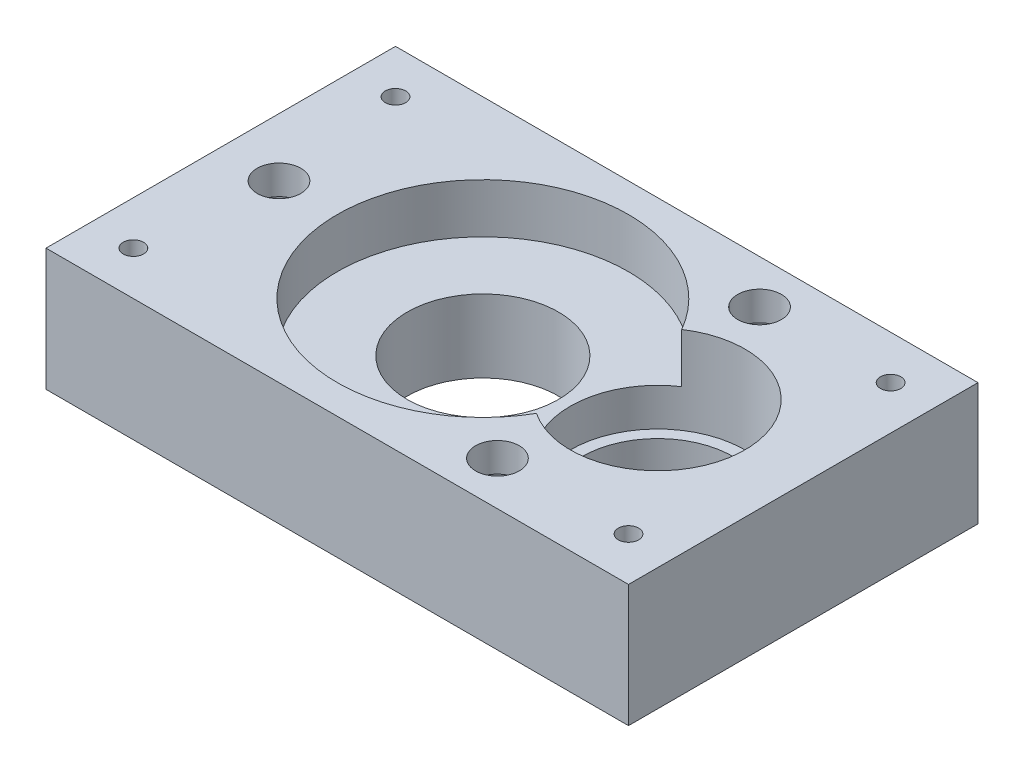
ISO-10303-21;
HEADER;
FILE_DESCRIPTION(('STEP AP214'),'2;1');
FILE_NAME('part.step','',(''),(''),'','','');
FILE_SCHEMA(('AUTOMOTIVE_DESIGN { 1 0 10303 214 1 1 1 1 }'));
ENDSEC;
DATA;
#1=APPLICATION_CONTEXT('core data for automotive mechanical design processes');
#2=APPLICATION_PROTOCOL_DEFINITION('international standard','automotive_design',2000,#1);
#3=PRODUCT_CONTEXT('',#1,'mechanical');
#4=PRODUCT('Part','Part','',(#3));
#5=PRODUCT_RELATED_PRODUCT_CATEGORY('part','',(#4));
#6=PRODUCT_DEFINITION_FORMATION('','',#4);
#7=PRODUCT_DEFINITION_CONTEXT('part definition',#1,'design');
#8=PRODUCT_DEFINITION('design','',#6,#7);
#9=PRODUCT_DEFINITION_SHAPE('','',#8);
#10=(LENGTH_UNIT() NAMED_UNIT(*) SI_UNIT(.MILLI.,.METRE.));
#11=(NAMED_UNIT(*) PLANE_ANGLE_UNIT() SI_UNIT($,.RADIAN.));
#12=(NAMED_UNIT(*) SI_UNIT($,.STERADIAN.) SOLID_ANGLE_UNIT());
#13=UNCERTAINTY_MEASURE_WITH_UNIT(LENGTH_MEASURE(1.E-05),#10,'distance_accuracy_value','');
#14=(GEOMETRIC_REPRESENTATION_CONTEXT(3) GLOBAL_UNCERTAINTY_ASSIGNED_CONTEXT((#13)) GLOBAL_UNIT_ASSIGNED_CONTEXT((#10,
#11,#12)) REPRESENTATION_CONTEXT('',''));
#15=CARTESIAN_POINT('',(0.,0.,0.));
#16=DIRECTION('',(0.,0.,1.));
#17=DIRECTION('',(1.,0.,0.));
#18=AXIS2_PLACEMENT_3D('',#15,#16,#17);
#19=CARTESIAN_POINT('',(0.,3.,0.));
#20=DIRECTION('',(0.,1.,0.));
#21=DIRECTION('',(0.,0.,1.));
#22=AXIS2_PLACEMENT_3D('',#19,#20,#21);
#23=PLANE('',#22);
#24=CARTESIAN_POINT('',(18.5,3.,1.5));
#25=DIRECTION('',(0.,1.,0.));
#26=DIRECTION('',(0.,0.,1.));
#27=AXIS2_PLACEMENT_3D('',#24,#25,#26);
#28=CIRCLE('',#27,0.350000000000001);
#29=CARTESIAN_POINT('',(18.5,3.,1.85));
#30=VERTEX_POINT('',#29);
#31=EDGE_CURVE('E282',#30,#30,#28,.T.);
#32=ORIENTED_EDGE('',*,*,#31,.F.);
#33=EDGE_LOOP('',(#32));
#34=FACE_BOUND('',#33,.T.);
#35=CARTESIAN_POINT('',(18.5,3.,10.5));
#36=DIRECTION('',(0.,1.,0.));
#37=DIRECTION('',(0.,0.,1.));
#38=AXIS2_PLACEMENT_3D('',#35,#36,#37);
#39=CIRCLE('',#38,0.350000000000001);
#40=CARTESIAN_POINT('',(18.5,3.,10.85));
#41=VERTEX_POINT('',#40);
#42=EDGE_CURVE('E291',#41,#41,#39,.T.);
#43=ORIENTED_EDGE('',*,*,#42,.F.);
#44=EDGE_LOOP('',(#43));
#45=FACE_BOUND('',#44,.T.);
#46=CARTESIAN_POINT('',(1.5,3.,10.5));
#47=DIRECTION('',(0.,1.,0.));
#48=DIRECTION('',(0.,0.,1.));
#49=AXIS2_PLACEMENT_3D('',#46,#47,#48);
#50=CIRCLE('',#49,0.349999999999999);
#51=CARTESIAN_POINT('',(1.5,3.,10.85));
#52=VERTEX_POINT('',#51);
#53=EDGE_CURVE('E602',#52,#52,#50,.T.);
#54=ORIENTED_EDGE('',*,*,#53,.F.);
#55=EDGE_LOOP('',(#54));
#56=FACE_BOUND('',#55,.T.);
#57=CARTESIAN_POINT('',(1.5,3.,1.5));
#58=DIRECTION('',(0.,1.,0.));
#59=DIRECTION('',(0.,0.,1.));
#60=AXIS2_PLACEMENT_3D('',#57,#58,#59);
#61=CIRCLE('',#60,0.349999999999999);
#62=CARTESIAN_POINT('',(1.5,3.,1.85));
#63=VERTEX_POINT('',#62);
#64=EDGE_CURVE('E596',#63,#63,#61,.T.);
#65=ORIENTED_EDGE('',*,*,#64,.F.);
#66=EDGE_LOOP('',(#65));
#67=FACE_BOUND('',#66,.T.);
#68=CARTESIAN_POINT('',(14.,3.,10.5));
#69=DIRECTION('',(0.,1.,0.));
#70=DIRECTION('',(0.,0.,1.));
#71=AXIS2_PLACEMENT_3D('',#68,#69,#70);
#72=CIRCLE('',#71,0.75);
#73=CARTESIAN_POINT('',(14.,3.,11.25));
#74=VERTEX_POINT('',#73);
#75=EDGE_CURVE('E592',#74,#74,#72,.T.);
#76=ORIENTED_EDGE('',*,*,#75,.F.);
#77=EDGE_LOOP('',(#76));
#78=FACE_BOUND('',#77,.T.);
#79=CARTESIAN_POINT('',(14.,3.,1.5));
#80=DIRECTION('',(0.,1.,0.));
#81=DIRECTION('',(0.,0.,1.));
#82=AXIS2_PLACEMENT_3D('',#79,#80,#81);
#83=CIRCLE('',#82,0.75);
#84=CARTESIAN_POINT('',(14.,3.,2.25));
#85=VERTEX_POINT('',#84);
#86=EDGE_CURVE('E301',#85,#85,#83,.T.);
#87=ORIENTED_EDGE('',*,*,#86,.F.);
#88=EDGE_LOOP('',(#87));
#89=FACE_BOUND('',#88,.T.);
#90=CARTESIAN_POINT('',(2.,3.,6.));
#91=DIRECTION('',(0.,1.,0.));
#92=DIRECTION('',(0.,0.,1.));
#93=AXIS2_PLACEMENT_3D('',#90,#91,#92);
#94=CIRCLE('',#93,0.75);
#95=CARTESIAN_POINT('',(2.,3.,6.75));
#96=VERTEX_POINT('',#95);
#97=EDGE_CURVE('E297',#96,#96,#94,.T.);
#98=ORIENTED_EDGE('',*,*,#97,.F.);
#99=EDGE_LOOP('',(#98));
#100=FACE_BOUND('',#99,.T.);
#101=DIRECTION('',(0.,0.,1.));
#102=VECTOR('',#101,1.);
#103=CARTESIAN_POINT('',(0.,3.,0.));
#104=LINE('',#103,#102);
#105=CARTESIAN_POINT('',(0.,3.,0.));
#106=VERTEX_POINT('',#105);
#107=CARTESIAN_POINT('',(0.,3.,12.));
#108=VERTEX_POINT('',#107);
#109=EDGE_CURVE('E258',#106,#108,#104,.T.);
#110=ORIENTED_EDGE('',*,*,#109,.T.);
#111=DIRECTION('',(1.,0.,0.));
#112=VECTOR('',#111,1.);
#113=CARTESIAN_POINT('',(0.,3.,12.));
#114=LINE('',#113,#112);
#115=CARTESIAN_POINT('',(20.,3.,12.));
#116=VERTEX_POINT('',#115);
#117=EDGE_CURVE('E261',#108,#116,#114,.T.);
#118=ORIENTED_EDGE('',*,*,#117,.T.);
#119=DIRECTION('',(0.,0.,1.));
#120=VECTOR('',#119,1.);
#121=CARTESIAN_POINT('',(20.,3.,0.));
#122=LINE('',#121,#120);
#123=CARTESIAN_POINT('',(20.,3.,0.));
#124=VERTEX_POINT('',#123);
#125=EDGE_CURVE('E263',#124,#116,#122,.T.);
#126=ORIENTED_EDGE('',*,*,#125,.F.);
#127=DIRECTION('',(1.,0.,0.));
#128=VECTOR('',#127,1.);
#129=CARTESIAN_POINT('',(0.,3.,0.));
#130=LINE('',#129,#128);
#131=EDGE_CURVE('E223',#106,#124,#130,.T.);
#132=ORIENTED_EDGE('',*,*,#131,.F.);
#133=EDGE_LOOP('',(#110,#118,#126,#132));
#134=FACE_BOUND('',#133,.T.);
#135=CARTESIAN_POINT('',(15.,3.,6.));
#136=DIRECTION('',(0.,1.,0.));
#137=DIRECTION('',(0.,0.,1.));
#138=AXIS2_PLACEMENT_3D('',#135,#136,#137);
#139=CIRCLE('',#138,3.);
#140=CARTESIAN_POINT('',(13.3333333333333,3.,8.49443825784929));
#141=VERTEX_POINT('',#140);
#142=CARTESIAN_POINT('',(13.3333333333333,3.,3.50556174215071));
#143=VERTEX_POINT('',#142);
#144=EDGE_CURVE('E256',#141,#143,#139,.T.);
#145=ORIENTED_EDGE('',*,*,#144,.F.);
#146=CARTESIAN_POINT('',(9.,3.,6.));
#147=DIRECTION('',(0.,1.,0.));
#148=DIRECTION('',(0.,0.,1.));
#149=AXIS2_PLACEMENT_3D('',#146,#147,#148);
#150=CIRCLE('',#149,5.);
#151=EDGE_CURVE('E254',#143,#141,#150,.T.);
#152=ORIENTED_EDGE('',*,*,#151,.F.);
#153=EDGE_LOOP('',(#145,#152));
#154=FACE_BOUND('',#153,.T.);
#155=ADVANCED_FACE('F163',(#34,#45,#56,#67,#78,#89,#100,#134,#154),#23,.T.);
#156=CARTESIAN_POINT('',(15.,3.,6.));
#157=DIRECTION('',(0.,-1.,0.));
#158=DIRECTION('',(0.,0.,-1.));
#159=AXIS2_PLACEMENT_3D('',#156,#157,#158);
#160=CYLINDRICAL_SURFACE('',#159,3.);
#161=CARTESIAN_POINT('',(15.,0.,6.));
#162=DIRECTION('',(0.,1.,0.));
#163=DIRECTION('',(0.,0.,1.));
#164=AXIS2_PLACEMENT_3D('',#161,#162,#163);
#165=CIRCLE('',#164,3.);
#166=CARTESIAN_POINT('',(15.,0.,9.));
#167=VERTEX_POINT('',#166);
#168=EDGE_CURVE('E13',#167,#167,#165,.T.);
#169=ORIENTED_EDGE('',*,*,#168,.F.);
#170=EDGE_LOOP('',(#169));
#171=FACE_BOUND('',#170,.T.);
#172=DIRECTION('',(0.,-1.,0.));
#173=VECTOR('',#172,1.);
#174=CARTESIAN_POINT('',(13.3333333333333,1.5,3.50556174215071));
#175=LINE('',#174,#173);
#176=CARTESIAN_POINT('',(13.3333333333333,1.3,3.50556174215071));
#177=VERTEX_POINT('',#176);
#178=EDGE_CURVE('E271',#143,#177,#175,.T.);
#179=ORIENTED_EDGE('',*,*,#178,.T.);
#180=CARTESIAN_POINT('',(15.,1.3,6.));
#181=DIRECTION('',(0.,1.,0.));
#182=DIRECTION('',(0.,0.,1.));
#183=AXIS2_PLACEMENT_3D('',#180,#181,#182);
#184=CIRCLE('',#183,3.);
#185=CARTESIAN_POINT('',(13.3333333333333,1.3,8.49443825784929));
#186=VERTEX_POINT('',#185);
#187=EDGE_CURVE('E247',#177,#186,#184,.T.);
#188=ORIENTED_EDGE('',*,*,#187,.T.);
#189=DIRECTION('',(0.,-1.,0.));
#190=VECTOR('',#189,1.);
#191=CARTESIAN_POINT('',(13.3333333333333,1.5,8.49443825784929));
#192=LINE('',#191,#190);
#193=EDGE_CURVE('E186',#186,#141,#192,.F.);
#194=ORIENTED_EDGE('',*,*,#193,.T.);
#195=ORIENTED_EDGE('',*,*,#144,.T.);
#196=EDGE_LOOP('',(#179,#188,#194,#195));
#197=FACE_BOUND('',#196,.T.);
#198=ADVANCED_FACE('F310',(#171,#197),#160,.F.);
#199=CARTESIAN_POINT('',(0.,3.,0.));
#200=DIRECTION('',(1.,0.,0.));
#201=DIRECTION('',(0.,0.,-1.));
#202=AXIS2_PLACEMENT_3D('',#199,#200,#201);
#203=PLANE('',#202);
#204=DIRECTION('',(0.,-1.,0.));
#205=VECTOR('',#204,1.);
#206=CARTESIAN_POINT('',(0.,3.,0.));
#207=LINE('',#206,#205);
#208=CARTESIAN_POINT('',(0.,-1.2,0.));
#209=VERTEX_POINT('',#208);
#210=EDGE_CURVE('E229',#106,#209,#207,.T.);
#211=ORIENTED_EDGE('',*,*,#210,.T.);
#212=DIRECTION('',(0.,0.,-1.));
#213=VECTOR('',#212,1.);
#214=CARTESIAN_POINT('',(0.,-1.2,0.));
#215=LINE('',#214,#213);
#216=CARTESIAN_POINT('',(0.,-1.2,12.));
#217=VERTEX_POINT('',#216);
#218=EDGE_CURVE('E239',#217,#209,#215,.T.);
#219=ORIENTED_EDGE('',*,*,#218,.F.);
#220=DIRECTION('',(0.,-1.,0.));
#221=VECTOR('',#220,1.);
#222=CARTESIAN_POINT('',(0.,3.,12.));
#223=LINE('',#222,#221);
#224=EDGE_CURVE('E268',#108,#217,#223,.T.);
#225=ORIENTED_EDGE('',*,*,#224,.F.);
#226=ORIENTED_EDGE('',*,*,#109,.F.);
#227=EDGE_LOOP('',(#211,#219,#225,#226));
#228=FACE_BOUND('',#227,.T.);
#229=ADVANCED_FACE('F165',(#228),#203,.F.);
#230=CARTESIAN_POINT('',(0.,3.,12.));
#231=DIRECTION('',(0.,0.,-1.));
#232=DIRECTION('',(-1.,0.,0.));
#233=AXIS2_PLACEMENT_3D('',#230,#231,#232);
#234=PLANE('',#233);
#235=ORIENTED_EDGE('',*,*,#224,.T.);
#236=DIRECTION('',(-1.,0.,0.));
#237=VECTOR('',#236,1.);
#238=CARTESIAN_POINT('',(0.,-1.2,12.));
#239=LINE('',#238,#237);
#240=CARTESIAN_POINT('',(20.,-1.2,12.));
#241=VERTEX_POINT('',#240);
#242=EDGE_CURVE('E252',#241,#217,#239,.T.);
#243=ORIENTED_EDGE('',*,*,#242,.F.);
#244=DIRECTION('',(0.,-1.,0.));
#245=VECTOR('',#244,1.);
#246=CARTESIAN_POINT('',(20.,3.,12.));
#247=LINE('',#246,#245);
#248=EDGE_CURVE('E228',#116,#241,#247,.T.);
#249=ORIENTED_EDGE('',*,*,#248,.F.);
#250=ORIENTED_EDGE('',*,*,#117,.F.);
#251=EDGE_LOOP('',(#235,#243,#249,#250));
#252=FACE_BOUND('',#251,.T.);
#253=ADVANCED_FACE('F341',(#252),#234,.F.);
#254=CARTESIAN_POINT('',(20.,3.,0.));
#255=DIRECTION('',(1.,0.,0.));
#256=DIRECTION('',(0.,0.,-1.));
#257=AXIS2_PLACEMENT_3D('',#254,#255,#256);
#258=PLANE('',#257);
#259=ORIENTED_EDGE('',*,*,#248,.T.);
#260=DIRECTION('',(0.,0.,-1.));
#261=VECTOR('',#260,1.);
#262=CARTESIAN_POINT('',(20.,-1.2,0.));
#263=LINE('',#262,#261);
#264=CARTESIAN_POINT('',(20.,-1.2,0.));
#265=VERTEX_POINT('',#264);
#266=EDGE_CURVE('E237',#241,#265,#263,.T.);
#267=ORIENTED_EDGE('',*,*,#266,.T.);
#268=DIRECTION('',(0.,-1.,0.));
#269=VECTOR('',#268,1.);
#270=CARTESIAN_POINT('',(20.,3.,0.));
#271=LINE('',#270,#269);
#272=EDGE_CURVE('E218',#124,#265,#271,.T.);
#273=ORIENTED_EDGE('',*,*,#272,.F.);
#274=ORIENTED_EDGE('',*,*,#125,.T.);
#275=EDGE_LOOP('',(#259,#267,#273,#274));
#276=FACE_BOUND('',#275,.T.);
#277=ADVANCED_FACE('F241',(#276),#258,.T.);
#278=CARTESIAN_POINT('',(0.,3.,0.));
#279=DIRECTION('',(0.,0.,-1.));
#280=DIRECTION('',(-1.,0.,0.));
#281=AXIS2_PLACEMENT_3D('',#278,#279,#280);
#282=PLANE('',#281);
#283=ORIENTED_EDGE('',*,*,#272,.T.);
#284=DIRECTION('',(-1.,0.,0.));
#285=VECTOR('',#284,1.);
#286=CARTESIAN_POINT('',(0.,-1.2,0.));
#287=LINE('',#286,#285);
#288=EDGE_CURVE('E221',#265,#209,#287,.T.);
#289=ORIENTED_EDGE('',*,*,#288,.T.);
#290=ORIENTED_EDGE('',*,*,#210,.F.);
#291=ORIENTED_EDGE('',*,*,#131,.T.);
#292=EDGE_LOOP('',(#283,#289,#290,#291));
#293=FACE_BOUND('',#292,.T.);
#294=ADVANCED_FACE('F220',(#293),#282,.T.);
#295=CARTESIAN_POINT('',(9.,3.,6.));
#296=DIRECTION('',(0.,-1.,0.));
#297=DIRECTION('',(0.,0.,-1.));
#298=AXIS2_PLACEMENT_3D('',#295,#296,#297);
#299=CYLINDRICAL_SURFACE('',#298,5.);
#300=CARTESIAN_POINT('',(9.,1.3,6.));
#301=DIRECTION('',(0.,1.,0.));
#302=DIRECTION('',(0.,0.,1.));
#303=AXIS2_PLACEMENT_3D('',#300,#301,#302);
#304=CIRCLE('',#303,5.);
#305=EDGE_CURVE('E172',#177,#186,#304,.T.);
#306=ORIENTED_EDGE('',*,*,#305,.F.);
#307=ORIENTED_EDGE('',*,*,#178,.F.);
#308=ORIENTED_EDGE('',*,*,#151,.T.);
#309=ORIENTED_EDGE('',*,*,#193,.F.);
#310=EDGE_LOOP('',(#306,#307,#308,#309));
#311=FACE_BOUND('',#310,.T.);
#312=ADVANCED_FACE('F314',(#311),#299,.F.);
#313=CARTESIAN_POINT('',(0.,1.3,0.));
#314=DIRECTION('',(0.,1.,0.));
#315=DIRECTION('',(0.,0.,1.));
#316=AXIS2_PLACEMENT_3D('',#313,#314,#315);
#317=PLANE('',#316);
#318=CARTESIAN_POINT('',(9.,1.3,6.));
#319=DIRECTION('',(0.,1.,0.));
#320=DIRECTION('',(0.,0.,1.));
#321=AXIS2_PLACEMENT_3D('',#318,#319,#320);
#322=CIRCLE('',#321,2.6);
#323=CARTESIAN_POINT('',(9.,1.3,8.6));
#324=VERTEX_POINT('',#323);
#325=EDGE_CURVE('E305',#324,#324,#322,.T.);
#326=ORIENTED_EDGE('',*,*,#325,.F.);
#327=EDGE_LOOP('',(#326));
#328=FACE_BOUND('',#327,.T.);
#329=ORIENTED_EDGE('',*,*,#187,.F.);
#330=ORIENTED_EDGE('',*,*,#305,.T.);
#331=EDGE_LOOP('',(#329,#330));
#332=FACE_BOUND('',#331,.T.);
#333=ADVANCED_FACE('F312',(#328,#332),#317,.T.);
#334=CARTESIAN_POINT('',(0.,-1.2,0.));
#335=DIRECTION('',(0.,1.,0.));
#336=DIRECTION('',(0.,0.,1.));
#337=AXIS2_PLACEMENT_3D('',#334,#335,#336);
#338=PLANE('',#337);
#339=CARTESIAN_POINT('',(14.,-1.2,1.5));
#340=DIRECTION('',(0.,1.,0.));
#341=DIRECTION('',(0.,0.,1.));
#342=AXIS2_PLACEMENT_3D('',#339,#340,#341);
#343=CIRCLE('',#342,1.);
#344=CARTESIAN_POINT('',(14.,-1.2,2.5));
#345=VERTEX_POINT('',#344);
#346=EDGE_CURVE('E632',#345,#345,#343,.T.);
#347=ORIENTED_EDGE('',*,*,#346,.T.);
#348=EDGE_LOOP('',(#347));
#349=FACE_BOUND('',#348,.T.);
#350=CARTESIAN_POINT('',(14.,-1.2,10.5));
#351=DIRECTION('',(0.,1.,0.));
#352=DIRECTION('',(0.,0.,1.));
#353=AXIS2_PLACEMENT_3D('',#350,#351,#352);
#354=CIRCLE('',#353,0.999999999999999);
#355=CARTESIAN_POINT('',(14.,-1.2,11.5));
#356=VERTEX_POINT('',#355);
#357=EDGE_CURVE('E587',#356,#356,#354,.T.);
#358=ORIENTED_EDGE('',*,*,#357,.T.);
#359=EDGE_LOOP('',(#358));
#360=FACE_BOUND('',#359,.T.);
#361=CARTESIAN_POINT('',(2.,-1.2,6.));
#362=DIRECTION('',(0.,1.,0.));
#363=DIRECTION('',(0.,0.,1.));
#364=AXIS2_PLACEMENT_3D('',#361,#362,#363);
#365=CIRCLE('',#364,1.);
#366=CARTESIAN_POINT('',(2.,-1.2,7.));
#367=VERTEX_POINT('',#366);
#368=EDGE_CURVE('E581',#367,#367,#365,.T.);
#369=ORIENTED_EDGE('',*,*,#368,.T.);
#370=EDGE_LOOP('',(#369));
#371=FACE_BOUND('',#370,.T.);
#372=CARTESIAN_POINT('',(18.5,-1.2,1.5));
#373=DIRECTION('',(0.,1.,0.));
#374=DIRECTION('',(0.,0.,1.));
#375=AXIS2_PLACEMENT_3D('',#372,#373,#374);
#376=CIRCLE('',#375,0.350000000000001);
#377=CARTESIAN_POINT('',(18.5,-1.2,1.85));
#378=VERTEX_POINT('',#377);
#379=EDGE_CURVE('E286',#378,#378,#376,.T.);
#380=ORIENTED_EDGE('',*,*,#379,.T.);
#381=EDGE_LOOP('',(#380));
#382=FACE_BOUND('',#381,.T.);
#383=CARTESIAN_POINT('',(18.5,-1.2,10.5));
#384=DIRECTION('',(0.,1.,0.));
#385=DIRECTION('',(0.,0.,1.));
#386=AXIS2_PLACEMENT_3D('',#383,#384,#385);
#387=CIRCLE('',#386,0.350000000000001);
#388=CARTESIAN_POINT('',(18.5,-1.2,10.85));
#389=VERTEX_POINT('',#388);
#390=EDGE_CURVE('E294',#389,#389,#387,.T.);
#391=ORIENTED_EDGE('',*,*,#390,.T.);
#392=EDGE_LOOP('',(#391));
#393=FACE_BOUND('',#392,.T.);
#394=CARTESIAN_POINT('',(1.5,-1.2,10.5));
#395=DIRECTION('',(0.,1.,0.));
#396=DIRECTION('',(0.,0.,1.));
#397=AXIS2_PLACEMENT_3D('',#394,#395,#396);
#398=CIRCLE('',#397,0.349999999999999);
#399=CARTESIAN_POINT('',(1.5,-1.2,10.85));
#400=VERTEX_POINT('',#399);
#401=EDGE_CURVE('E599',#400,#400,#398,.T.);
#402=ORIENTED_EDGE('',*,*,#401,.T.);
#403=EDGE_LOOP('',(#402));
#404=FACE_BOUND('',#403,.T.);
#405=CARTESIAN_POINT('',(1.5,-1.2,1.5));
#406=DIRECTION('',(0.,1.,0.));
#407=DIRECTION('',(0.,0.,1.));
#408=AXIS2_PLACEMENT_3D('',#405,#406,#407);
#409=CIRCLE('',#408,0.349999999999999);
#410=CARTESIAN_POINT('',(1.5,-1.2,1.85));
#411=VERTEX_POINT('',#410);
#412=EDGE_CURVE('E595',#411,#411,#409,.T.);
#413=ORIENTED_EDGE('',*,*,#412,.T.);
#414=EDGE_LOOP('',(#413));
#415=FACE_BOUND('',#414,.T.);
#416=CARTESIAN_POINT('',(9.,-1.2,6.));
#417=DIRECTION('',(0.,1.,0.));
#418=DIRECTION('',(0.,0.,1.));
#419=AXIS2_PLACEMENT_3D('',#416,#417,#418);
#420=CIRCLE('',#419,2.6);
#421=CARTESIAN_POINT('',(9.,-1.2,8.6));
#422=VERTEX_POINT('',#421);
#423=EDGE_CURVE('E244',#422,#422,#420,.T.);
#424=ORIENTED_EDGE('',*,*,#423,.T.);
#425=EDGE_LOOP('',(#424));
#426=FACE_BOUND('',#425,.T.);
#427=ORIENTED_EDGE('',*,*,#266,.F.);
#428=ORIENTED_EDGE('',*,*,#242,.T.);
#429=ORIENTED_EDGE('',*,*,#218,.T.);
#430=ORIENTED_EDGE('',*,*,#288,.F.);
#431=EDGE_LOOP('',(#427,#428,#429,#430));
#432=FACE_BOUND('',#431,.T.);
#433=CARTESIAN_POINT('',(15.,-1.2,6.));
#434=DIRECTION('',(0.,1.,0.));
#435=DIRECTION('',(0.,0.,1.));
#436=AXIS2_PLACEMENT_3D('',#433,#434,#435);
#437=CIRCLE('',#436,2.6);
#438=CARTESIAN_POINT('',(15.,-1.2,8.6));
#439=VERTEX_POINT('',#438);
#440=EDGE_CURVE('E300',#439,#439,#437,.T.);
#441=ORIENTED_EDGE('',*,*,#440,.T.);
#442=EDGE_LOOP('',(#441));
#443=FACE_BOUND('',#442,.T.);
#444=ADVANCED_FACE('F234',(#349,#360,#371,#382,#393,#404,#415,#426,#432,#443),#338,.F.);
#445=CARTESIAN_POINT('',(9.,-1.2,6.));
#446=DIRECTION('',(0.,1.,0.));
#447=DIRECTION('',(0.,0.,1.));
#448=AXIS2_PLACEMENT_3D('',#445,#446,#447);
#449=CYLINDRICAL_SURFACE('',#448,2.6);
#450=ORIENTED_EDGE('',*,*,#325,.T.);
#451=EDGE_LOOP('',(#450));
#452=FACE_BOUND('',#451,.T.);
#453=ORIENTED_EDGE('',*,*,#423,.F.);
#454=EDGE_LOOP('',(#453));
#455=FACE_BOUND('',#454,.T.);
#456=ADVANCED_FACE('F321',(#452,#455),#449,.F.);
#457=CARTESIAN_POINT('',(0.,0.,0.));
#458=DIRECTION('',(0.,1.,0.));
#459=DIRECTION('',(0.,0.,1.));
#460=AXIS2_PLACEMENT_3D('',#457,#458,#459);
#461=PLANE('',#460);
#462=ORIENTED_EDGE('',*,*,#168,.T.);
#463=EDGE_LOOP('',(#462));
#464=FACE_BOUND('',#463,.T.);
#465=CARTESIAN_POINT('',(15.,0.,6.));
#466=DIRECTION('',(0.,1.,0.));
#467=DIRECTION('',(0.,0.,1.));
#468=AXIS2_PLACEMENT_3D('',#465,#466,#467);
#469=CIRCLE('',#468,2.6);
#470=CARTESIAN_POINT('',(15.,0.,8.6));
#471=VERTEX_POINT('',#470);
#472=EDGE_CURVE('E302',#471,#471,#469,.T.);
#473=ORIENTED_EDGE('',*,*,#472,.F.);
#474=EDGE_LOOP('',(#473));
#475=FACE_BOUND('',#474,.T.);
#476=ADVANCED_FACE('F551',(#464,#475),#461,.T.);
#477=CARTESIAN_POINT('',(15.,0.,6.));
#478=DIRECTION('',(0.,-1.,0.));
#479=DIRECTION('',(0.,0.,-1.));
#480=AXIS2_PLACEMENT_3D('',#477,#478,#479);
#481=CYLINDRICAL_SURFACE('',#480,2.6);
#482=ORIENTED_EDGE('',*,*,#472,.T.);
#483=EDGE_LOOP('',(#482));
#484=FACE_BOUND('',#483,.T.);
#485=ORIENTED_EDGE('',*,*,#440,.F.);
#486=EDGE_LOOP('',(#485));
#487=FACE_BOUND('',#486,.T.);
#488=ADVANCED_FACE('F409',(#484,#487),#481,.F.);
#489=CARTESIAN_POINT('',(2.,3.,6.));
#490=DIRECTION('',(0.,-1.,0.));
#491=DIRECTION('',(0.,0.,-1.));
#492=AXIS2_PLACEMENT_3D('',#489,#490,#491);
#493=CYLINDRICAL_SURFACE('',#492,0.75);
#494=CARTESIAN_POINT('',(2.,2.,6.));
#495=DIRECTION('',(0.,1.,0.));
#496=DIRECTION('',(0.,0.,1.));
#497=AXIS2_PLACEMENT_3D('',#494,#495,#496);
#498=CIRCLE('',#497,0.75);
#499=CARTESIAN_POINT('',(2.,2.,6.75));
#500=VERTEX_POINT('',#499);
#501=EDGE_CURVE('E167',#500,#500,#498,.T.);
#502=ORIENTED_EDGE('',*,*,#501,.F.);
#503=EDGE_LOOP('',(#502));
#504=FACE_BOUND('',#503,.T.);
#505=ORIENTED_EDGE('',*,*,#97,.T.);
#506=EDGE_LOOP('',(#505));
#507=FACE_BOUND('',#506,.T.);
#508=ADVANCED_FACE('F468',(#504,#507),#493,.F.);
#509=CARTESIAN_POINT('',(14.,3.,1.5));
#510=DIRECTION('',(0.,-1.,0.));
#511=DIRECTION('',(0.,0.,-1.));
#512=AXIS2_PLACEMENT_3D('',#509,#510,#511);
#513=CYLINDRICAL_SURFACE('',#512,0.75);
#514=CARTESIAN_POINT('',(14.,2.,1.5));
#515=DIRECTION('',(0.,1.,0.));
#516=DIRECTION('',(0.,0.,1.));
#517=AXIS2_PLACEMENT_3D('',#514,#515,#516);
#518=CIRCLE('',#517,0.75);
#519=CARTESIAN_POINT('',(14.,2.,2.25));
#520=VERTEX_POINT('',#519);
#521=EDGE_CURVE('E276',#520,#520,#518,.T.);
#522=ORIENTED_EDGE('',*,*,#521,.F.);
#523=EDGE_LOOP('',(#522));
#524=FACE_BOUND('',#523,.T.);
#525=ORIENTED_EDGE('',*,*,#86,.T.);
#526=EDGE_LOOP('',(#525));
#527=FACE_BOUND('',#526,.T.);
#528=ADVANCED_FACE('F473',(#524,#527),#513,.F.);
#529=CARTESIAN_POINT('',(14.,3.,10.5));
#530=DIRECTION('',(0.,-1.,0.));
#531=DIRECTION('',(0.,0.,-1.));
#532=AXIS2_PLACEMENT_3D('',#529,#530,#531);
#533=CYLINDRICAL_SURFACE('',#532,0.75);
#534=CARTESIAN_POINT('',(14.,2.,10.5));
#535=DIRECTION('',(0.,1.,0.));
#536=DIRECTION('',(0.,0.,1.));
#537=AXIS2_PLACEMENT_3D('',#534,#535,#536);
#538=CIRCLE('',#537,0.75);
#539=CARTESIAN_POINT('',(14.,2.,11.25));
#540=VERTEX_POINT('',#539);
#541=EDGE_CURVE('E274',#540,#540,#538,.T.);
#542=ORIENTED_EDGE('',*,*,#541,.F.);
#543=EDGE_LOOP('',(#542));
#544=FACE_BOUND('',#543,.T.);
#545=ORIENTED_EDGE('',*,*,#75,.T.);
#546=EDGE_LOOP('',(#545));
#547=FACE_BOUND('',#546,.T.);
#548=ADVANCED_FACE('F420',(#544,#547),#533,.F.);
#549=CARTESIAN_POINT('',(1.5,3.,1.5));
#550=DIRECTION('',(0.,-1.,0.));
#551=DIRECTION('',(0.,0.,-1.));
#552=AXIS2_PLACEMENT_3D('',#549,#550,#551);
#553=CYLINDRICAL_SURFACE('',#552,0.349999999999999);
#554=ORIENTED_EDGE('',*,*,#64,.T.);
#555=EDGE_LOOP('',(#554));
#556=FACE_BOUND('',#555,.T.);
#557=ORIENTED_EDGE('',*,*,#412,.F.);
#558=EDGE_LOOP('',(#557));
#559=FACE_BOUND('',#558,.T.);
#560=ADVANCED_FACE('F414',(#556,#559),#553,.F.);
#561=CARTESIAN_POINT('',(1.5,3.,10.5));
#562=DIRECTION('',(0.,-1.,0.));
#563=DIRECTION('',(0.,0.,-1.));
#564=AXIS2_PLACEMENT_3D('',#561,#562,#563);
#565=CYLINDRICAL_SURFACE('',#564,0.349999999999999);
#566=ORIENTED_EDGE('',*,*,#53,.T.);
#567=EDGE_LOOP('',(#566));
#568=FACE_BOUND('',#567,.T.);
#569=ORIENTED_EDGE('',*,*,#401,.F.);
#570=EDGE_LOOP('',(#569));
#571=FACE_BOUND('',#570,.T.);
#572=ADVANCED_FACE('F419',(#568,#571),#565,.F.);
#573=CARTESIAN_POINT('',(18.5,3.,10.5));
#574=DIRECTION('',(0.,-1.,0.));
#575=DIRECTION('',(0.,0.,-1.));
#576=AXIS2_PLACEMENT_3D('',#573,#574,#575);
#577=CYLINDRICAL_SURFACE('',#576,0.350000000000001);
#578=ORIENTED_EDGE('',*,*,#42,.T.);
#579=EDGE_LOOP('',(#578));
#580=FACE_BOUND('',#579,.T.);
#581=ORIENTED_EDGE('',*,*,#390,.F.);
#582=EDGE_LOOP('',(#581));
#583=FACE_BOUND('',#582,.T.);
#584=ADVANCED_FACE('F432',(#580,#583),#577,.F.);
#585=CARTESIAN_POINT('',(18.5,3.,1.5));
#586=DIRECTION('',(0.,-1.,0.));
#587=DIRECTION('',(0.,0.,-1.));
#588=AXIS2_PLACEMENT_3D('',#585,#586,#587);
#589=CYLINDRICAL_SURFACE('',#588,0.350000000000001);
#590=ORIENTED_EDGE('',*,*,#31,.T.);
#591=EDGE_LOOP('',(#590));
#592=FACE_BOUND('',#591,.T.);
#593=ORIENTED_EDGE('',*,*,#379,.F.);
#594=EDGE_LOOP('',(#593));
#595=FACE_BOUND('',#594,.T.);
#596=ADVANCED_FACE('F442',(#592,#595),#589,.F.);
#597=CARTESIAN_POINT('',(14.,5.82842712474619,10.5));
#598=DIRECTION('',(0.,-1.,0.));
#599=DIRECTION('',(0.,0.,-1.));
#600=AXIS2_PLACEMENT_3D('',#597,#598,#599);
#601=CYLINDRICAL_SURFACE('',#600,0.999999999999999);
#602=ORIENTED_EDGE('',*,*,#357,.F.);
#603=EDGE_LOOP('',(#602));
#604=FACE_BOUND('',#603,.T.);
#605=CARTESIAN_POINT('',(14.,2.,10.5));
#606=DIRECTION('',(0.,1.,0.));
#607=DIRECTION('',(0.,0.,1.));
#608=AXIS2_PLACEMENT_3D('',#605,#606,#607);
#609=CIRCLE('',#608,0.999999999999999);
#610=CARTESIAN_POINT('',(14.,2.,11.5));
#611=VERTEX_POINT('',#610);
#612=EDGE_CURVE('E584',#611,#611,#609,.T.);
#613=ORIENTED_EDGE('',*,*,#612,.T.);
#614=EDGE_LOOP('',(#613));
#615=FACE_BOUND('',#614,.T.);
#616=ADVANCED_FACE('F452',(#604,#615),#601,.F.);
#617=CARTESIAN_POINT('',(0.,2.,0.));
#618=DIRECTION('',(0.,1.,0.));
#619=DIRECTION('',(0.,0.,1.));
#620=AXIS2_PLACEMENT_3D('',#617,#618,#619);
#621=PLANE('',#620);
#622=ORIENTED_EDGE('',*,*,#541,.T.);
#623=EDGE_LOOP('',(#622));
#624=FACE_BOUND('',#623,.T.);
#625=ORIENTED_EDGE('',*,*,#612,.F.);
#626=EDGE_LOOP('',(#625));
#627=FACE_BOUND('',#626,.T.);
#628=ADVANCED_FACE('F497',(#624,#627),#621,.F.);
#629=CARTESIAN_POINT('',(14.,5.82842712474619,1.5));
#630=DIRECTION('',(0.,-1.,0.));
#631=DIRECTION('',(0.,0.,-1.));
#632=AXIS2_PLACEMENT_3D('',#629,#630,#631);
#633=CYLINDRICAL_SURFACE('',#632,1.);
#634=ORIENTED_EDGE('',*,*,#346,.F.);
#635=EDGE_LOOP('',(#634));
#636=FACE_BOUND('',#635,.T.);
#637=CARTESIAN_POINT('',(14.,2.,1.5));
#638=DIRECTION('',(0.,1.,0.));
#639=DIRECTION('',(0.,0.,1.));
#640=AXIS2_PLACEMENT_3D('',#637,#638,#639);
#641=CIRCLE('',#640,1.);
#642=CARTESIAN_POINT('',(14.,2.,2.5));
#643=VERTEX_POINT('',#642);
#644=EDGE_CURVE('E277',#643,#643,#641,.T.);
#645=ORIENTED_EDGE('',*,*,#644,.T.);
#646=EDGE_LOOP('',(#645));
#647=FACE_BOUND('',#646,.T.);
#648=ADVANCED_FACE('F507',(#636,#647),#633,.F.);
#649=CARTESIAN_POINT('',(0.,2.,0.));
#650=DIRECTION('',(0.,1.,0.));
#651=DIRECTION('',(0.,0.,1.));
#652=AXIS2_PLACEMENT_3D('',#649,#650,#651);
#653=PLANE('',#652);
#654=ORIENTED_EDGE('',*,*,#521,.T.);
#655=EDGE_LOOP('',(#654));
#656=FACE_BOUND('',#655,.T.);
#657=ORIENTED_EDGE('',*,*,#644,.F.);
#658=EDGE_LOOP('',(#657));
#659=FACE_BOUND('',#658,.T.);
#660=ADVANCED_FACE('F517',(#656,#659),#653,.F.);
#661=CARTESIAN_POINT('',(2.,5.82842712474619,6.));
#662=DIRECTION('',(0.,-1.,0.));
#663=DIRECTION('',(0.,0.,-1.));
#664=AXIS2_PLACEMENT_3D('',#661,#662,#663);
#665=CYLINDRICAL_SURFACE('',#664,1.);
#666=ORIENTED_EDGE('',*,*,#368,.F.);
#667=EDGE_LOOP('',(#666));
#668=FACE_BOUND('',#667,.T.);
#669=CARTESIAN_POINT('',(2.,2.,6.));
#670=DIRECTION('',(0.,1.,0.));
#671=DIRECTION('',(0.,0.,1.));
#672=AXIS2_PLACEMENT_3D('',#669,#670,#671);
#673=CIRCLE('',#672,1.);
#674=CARTESIAN_POINT('',(2.,2.,7.));
#675=VERTEX_POINT('',#674);
#676=EDGE_CURVE('E579',#675,#675,#673,.T.);
#677=ORIENTED_EDGE('',*,*,#676,.T.);
#678=EDGE_LOOP('',(#677));
#679=FACE_BOUND('',#678,.T.);
#680=ADVANCED_FACE('F527',(#668,#679),#665,.F.);
#681=CARTESIAN_POINT('',(0.,2.,0.));
#682=DIRECTION('',(0.,1.,0.));
#683=DIRECTION('',(0.,0.,1.));
#684=AXIS2_PLACEMENT_3D('',#681,#682,#683);
#685=PLANE('',#684);
#686=ORIENTED_EDGE('',*,*,#501,.T.);
#687=EDGE_LOOP('',(#686));
#688=FACE_BOUND('',#687,.T.);
#689=ORIENTED_EDGE('',*,*,#676,.F.);
#690=EDGE_LOOP('',(#689));
#691=FACE_BOUND('',#690,.T.);
#692=ADVANCED_FACE('F536',(#688,#691),#685,.F.);
#693=CLOSED_SHELL('',(#155,#198,#229,#253,#277,#294,#312,#333,#444,#456,#476,#488,#508,#528,
#548,#560,#572,#584,#596,#616,#628,#648,#660,#680,#692));
#694=MANIFOLD_SOLID_BREP('B2',#693);
#695=ADVANCED_BREP_SHAPE_REPRESENTATION('',(#18,#694),#14);
#696=SHAPE_DEFINITION_REPRESENTATION(#9,#695);
ENDSEC;
END-ISO-10303-21;
